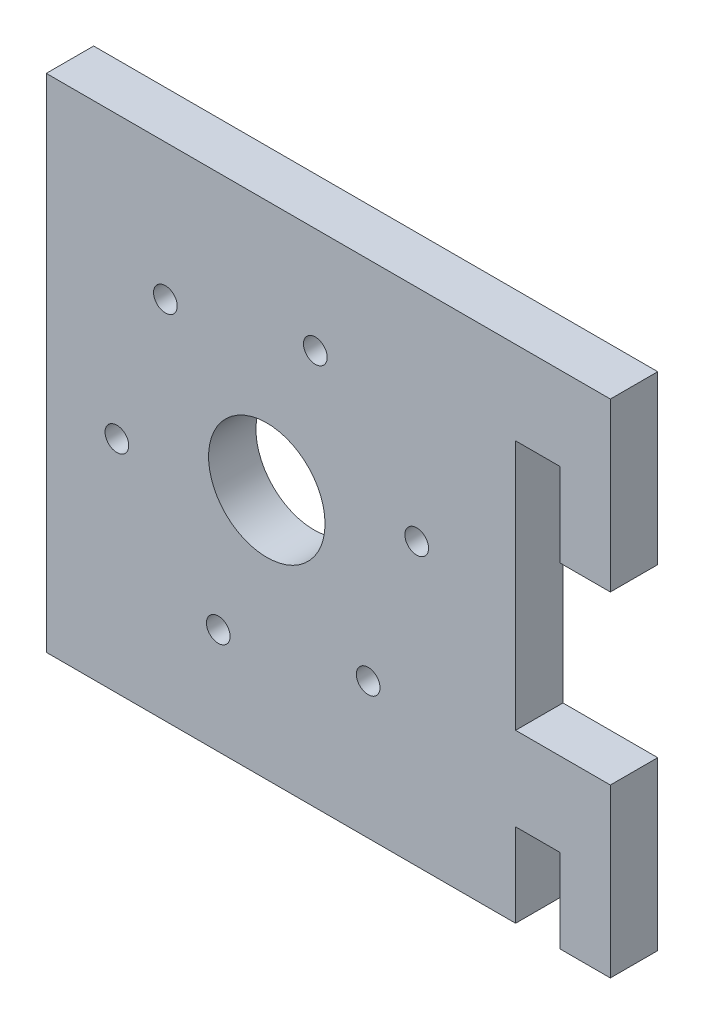
ISO-10303-21;
HEADER;
FILE_DESCRIPTION(('STEP AP214'),'2;1');
FILE_NAME('part.step','',(''),(''),'','','');
FILE_SCHEMA(('AUTOMOTIVE_DESIGN { 1 0 10303 214 1 1 1 1 }'));
ENDSEC;
DATA;
#1=APPLICATION_CONTEXT('core data for automotive mechanical design processes');
#2=APPLICATION_PROTOCOL_DEFINITION('international standard','automotive_design',2000,#1);
#3=PRODUCT_CONTEXT('',#1,'mechanical');
#4=PRODUCT('Part','Part','',(#3));
#5=PRODUCT_RELATED_PRODUCT_CATEGORY('part','',(#4));
#6=PRODUCT_DEFINITION_FORMATION('','',#4);
#7=PRODUCT_DEFINITION_CONTEXT('part definition',#1,'design');
#8=PRODUCT_DEFINITION('design','',#6,#7);
#9=PRODUCT_DEFINITION_SHAPE('','',#8);
#10=(LENGTH_UNIT() NAMED_UNIT(*) SI_UNIT(.MILLI.,.METRE.));
#11=(NAMED_UNIT(*) PLANE_ANGLE_UNIT() SI_UNIT($,.RADIAN.));
#12=(NAMED_UNIT(*) SI_UNIT($,.STERADIAN.) SOLID_ANGLE_UNIT());
#13=UNCERTAINTY_MEASURE_WITH_UNIT(LENGTH_MEASURE(1.E-05),#10,'distance_accuracy_value','');
#14=(GEOMETRIC_REPRESENTATION_CONTEXT(3) GLOBAL_UNCERTAINTY_ASSIGNED_CONTEXT((#13)) GLOBAL_UNIT_ASSIGNED_CONTEXT((#10,
#11,#12)) REPRESENTATION_CONTEXT('',''));
#15=CARTESIAN_POINT('',(0.,0.,0.));
#16=DIRECTION('',(0.,0.,1.));
#17=DIRECTION('',(1.,0.,0.));
#18=AXIS2_PLACEMENT_3D('',#15,#16,#17);
#19=CARTESIAN_POINT('',(0.,0.,4.800000052));
#20=DIRECTION('',(0.,0.,-1.));
#21=DIRECTION('',(-1.,0.,0.));
#22=AXIS2_PLACEMENT_3D('',#19,#20,#21);
#23=PLANE('',#22);
#24=CARTESIAN_POINT('',(22.3424569625795,25.3999999999998,4.800000052));
#25=DIRECTION('',(0.,0.,1.));
#26=DIRECTION('',(1.,0.,0.));
#27=AXIS2_PLACEMENT_3D('',#24,#25,#26);
#28=CIRCLE('',#27,5.9);
#29=CARTESIAN_POINT('',(28.2424569625795,25.3999999999998,4.800000052));
#30=VERTEX_POINT('',#29);
#31=EDGE_CURVE('E267',#30,#30,#28,.T.);
#32=ORIENTED_EDGE('',*,*,#31,.F.);
#33=EDGE_LOOP('',(#32));
#34=FACE_BOUND('',#33,.T.);
#35=CARTESIAN_POINT('',(12.0704461789188,37.0075748742084,4.800000052));
#36=DIRECTION('',(0.,0.,1.));
#37=DIRECTION('',(1.,0.,0.));
#38=AXIS2_PLACEMENT_3D('',#35,#36,#37);
#39=CIRCLE('',#38,1.19999999997775);
#40=CARTESIAN_POINT('',(13.2704461788966,37.0075748742084,4.800000052));
#41=VERTEX_POINT('',#40);
#42=EDGE_CURVE('E237',#41,#41,#39,.T.);
#43=ORIENTED_EDGE('',*,*,#42,.F.);
#44=EDGE_LOOP('',(#43));
#45=FACE_BOUND('',#44,.T.);
#46=CARTESIAN_POINT('',(7.15399685335458,22.3079651505062,4.800000052));
#47=DIRECTION('',(0.,0.,1.));
#48=DIRECTION('',(1.,0.,0.));
#49=AXIS2_PLACEMENT_3D('',#46,#47,#48);
#50=CIRCLE('',#49,1.19999999997706);
#51=CARTESIAN_POINT('',(8.35399685333163,22.3079651505062,4.800000052));
#52=VERTEX_POINT('',#51);
#53=EDGE_CURVE('E234',#52,#52,#50,.T.);
#54=ORIENTED_EDGE('',*,*,#53,.F.);
#55=EDGE_LOOP('',(#54));
#56=FACE_BOUND('',#55,.T.);
#57=CARTESIAN_POINT('',(17.4260076370153,10.7003902762977,4.800000052));
#58=DIRECTION('',(0.,0.,1.));
#59=DIRECTION('',(1.,0.,0.));
#60=AXIS2_PLACEMENT_3D('',#57,#58,#59);
#61=CIRCLE('',#60,1.19999999997815);
#62=CARTESIAN_POINT('',(18.6260076369934,10.7003902762977,4.800000052));
#63=VERTEX_POINT('',#62);
#64=EDGE_CURVE('E241',#63,#63,#61,.T.);
#65=ORIENTED_EDGE('',*,*,#64,.F.);
#66=EDGE_LOOP('',(#65));
#67=FACE_BOUND('',#66,.T.);
#68=CARTESIAN_POINT('',(32.6144677462402,13.7924251257913,4.800000052));
#69=DIRECTION('',(0.,0.,1.));
#70=DIRECTION('',(1.,0.,0.));
#71=AXIS2_PLACEMENT_3D('',#68,#69,#70);
#72=CIRCLE('',#71,1.19999999997572);
#73=CARTESIAN_POINT('',(33.814467746216,13.7924251257913,4.800000052));
#74=VERTEX_POINT('',#73);
#75=EDGE_CURVE('E247',#74,#74,#72,.T.);
#76=ORIENTED_EDGE('',*,*,#75,.F.);
#77=EDGE_LOOP('',(#76));
#78=FACE_BOUND('',#77,.T.);
#79=CARTESIAN_POINT('',(37.5309170718045,28.4920348494934,4.800000052));
#80=DIRECTION('',(0.,0.,1.));
#81=DIRECTION('',(1.,0.,0.));
#82=AXIS2_PLACEMENT_3D('',#79,#80,#81);
#83=CIRCLE('',#82,1.1999999999763);
#84=CARTESIAN_POINT('',(38.7309170717808,28.4920348494934,4.800000052));
#85=VERTEX_POINT('',#84);
#86=EDGE_CURVE('E253',#85,#85,#83,.T.);
#87=ORIENTED_EDGE('',*,*,#86,.F.);
#88=EDGE_LOOP('',(#87));
#89=FACE_BOUND('',#88,.T.);
#90=CARTESIAN_POINT('',(27.2589062881437,40.099609723702,4.800000052));
#91=DIRECTION('',(0.,0.,1.));
#92=DIRECTION('',(1.,0.,0.));
#93=AXIS2_PLACEMENT_3D('',#90,#91,#92);
#94=CIRCLE('',#93,1.1999999999763);
#95=CARTESIAN_POINT('',(28.45890628812,40.099609723702,4.800000052));
#96=VERTEX_POINT('',#95);
#97=EDGE_CURVE('E259',#96,#96,#94,.T.);
#98=ORIENTED_EDGE('',*,*,#97,.F.);
#99=EDGE_LOOP('',(#98));
#100=FACE_BOUND('',#99,.T.);
#101=DIRECTION('',(0.,1.,0.));
#102=VECTOR('',#101,1.);
#103=CARTESIAN_POINT('',(47.549999896,0.,4.800000052));
#104=LINE('',#103,#102);
#105=CARTESIAN_POINT('',(47.549999896,16.9333333333333,4.800000052));
#106=VERTEX_POINT('',#105);
#107=CARTESIAN_POINT('',(47.549999896,42.3333333333333,4.800000052));
#108=VERTEX_POINT('',#107);
#109=EDGE_CURVE('E189',#106,#108,#104,.T.);
#110=ORIENTED_EDGE('',*,*,#109,.T.);
#111=DIRECTION('',(1.,0.,0.));
#112=VECTOR('',#111,1.);
#113=CARTESIAN_POINT('',(47.549999896,42.3333333333333,4.800000052));
#114=LINE('',#113,#112);
#115=CARTESIAN_POINT('',(52.05000004,42.3333333333333,4.800000052));
#116=VERTEX_POINT('',#115);
#117=EDGE_CURVE('E195',#108,#116,#114,.T.);
#118=ORIENTED_EDGE('',*,*,#117,.T.);
#119=DIRECTION('',(0.,1.,0.));
#120=VECTOR('',#119,1.);
#121=CARTESIAN_POINT('',(52.05000004,33.8666666666667,4.800000052));
#122=LINE('',#121,#120);
#123=CARTESIAN_POINT('',(52.05000004,33.8666666666667,4.800000052));
#124=VERTEX_POINT('',#123);
#125=EDGE_CURVE('E201',#124,#116,#122,.T.);
#126=ORIENTED_EDGE('',*,*,#125,.F.);
#127=DIRECTION('',(-1.,0.,0.));
#128=VECTOR('',#127,1.);
#129=CARTESIAN_POINT('',(57.15,33.8666666666667,4.800000052));
#130=LINE('',#129,#128);
#131=CARTESIAN_POINT('',(57.15,33.8666666666667,4.800000052));
#132=VERTEX_POINT('',#131);
#133=EDGE_CURVE('E273',#132,#124,#130,.T.);
#134=ORIENTED_EDGE('',*,*,#133,.F.);
#135=DIRECTION('',(0.,1.,0.));
#136=VECTOR('',#135,1.);
#137=CARTESIAN_POINT('',(57.15,0.,4.800000052));
#138=LINE('',#137,#136);
#139=CARTESIAN_POINT('',(57.15,50.8,4.800000052));
#140=VERTEX_POINT('',#139);
#141=EDGE_CURVE('E301',#132,#140,#138,.T.);
#142=ORIENTED_EDGE('',*,*,#141,.T.);
#143=DIRECTION('',(-1.,0.,0.));
#144=VECTOR('',#143,1.);
#145=CARTESIAN_POINT('',(0.,50.8,4.800000052));
#146=LINE('',#145,#144);
#147=CARTESIAN_POINT('',(0.,50.8,4.800000052));
#148=VERTEX_POINT('',#147);
#149=EDGE_CURVE('E305',#140,#148,#146,.T.);
#150=ORIENTED_EDGE('',*,*,#149,.T.);
#151=DIRECTION('',(0.,-1.,0.));
#152=VECTOR('',#151,1.);
#153=CARTESIAN_POINT('',(0.,0.,4.800000052));
#154=LINE('',#153,#152);
#155=CARTESIAN_POINT('',(0.,0.,4.800000052));
#156=VERTEX_POINT('',#155);
#157=EDGE_CURVE('E293',#148,#156,#154,.T.);
#158=ORIENTED_EDGE('',*,*,#157,.T.);
#159=DIRECTION('',(1.,0.,0.));
#160=VECTOR('',#159,1.);
#161=CARTESIAN_POINT('',(0.,0.,4.800000052));
#162=LINE('',#161,#160);
#163=CARTESIAN_POINT('',(47.549999896,0.,4.800000052));
#164=VERTEX_POINT('',#163);
#165=EDGE_CURVE('E298',#156,#164,#162,.T.);
#166=ORIENTED_EDGE('',*,*,#165,.T.);
#167=DIRECTION('',(0.,1.,0.));
#168=VECTOR('',#167,1.);
#169=CARTESIAN_POINT('',(47.549999896,0.,4.800000052));
#170=LINE('',#169,#168);
#171=CARTESIAN_POINT('',(47.549999896,8.46666666666667,4.800000052));
#172=VERTEX_POINT('',#171);
#173=EDGE_CURVE('E213',#164,#172,#170,.T.);
#174=ORIENTED_EDGE('',*,*,#173,.T.);
#175=DIRECTION('',(1.,0.,0.));
#176=VECTOR('',#175,1.);
#177=CARTESIAN_POINT('',(47.549999896,8.46666666666667,4.800000052));
#178=LINE('',#177,#176);
#179=CARTESIAN_POINT('',(52.05000004,8.46666666666667,4.800000052));
#180=VERTEX_POINT('',#179);
#181=EDGE_CURVE('E219',#172,#180,#178,.T.);
#182=ORIENTED_EDGE('',*,*,#181,.T.);
#183=DIRECTION('',(0.,1.,0.));
#184=VECTOR('',#183,1.);
#185=CARTESIAN_POINT('',(52.05000004,0.,4.800000052));
#186=LINE('',#185,#184);
#187=CARTESIAN_POINT('',(52.05000004,0.,4.800000052));
#188=VERTEX_POINT('',#187);
#189=EDGE_CURVE('E222',#188,#180,#186,.T.);
#190=ORIENTED_EDGE('',*,*,#189,.F.);
#191=CARTESIAN_POINT('',(57.15,0.,4.800000052));
#192=VERTEX_POINT('',#191);
#193=EDGE_CURVE('E296',#188,#192,#162,.T.);
#194=ORIENTED_EDGE('',*,*,#193,.T.);
#195=CARTESIAN_POINT('',(57.15,16.9333333333333,4.800000052));
#196=VERTEX_POINT('',#195);
#197=EDGE_CURVE('E302',#192,#196,#138,.T.);
#198=ORIENTED_EDGE('',*,*,#197,.T.);
#199=DIRECTION('',(-1.,0.,0.));
#200=VECTOR('',#199,1.);
#201=CARTESIAN_POINT('',(57.15,16.9333333333333,4.800000052));
#202=LINE('',#201,#200);
#203=EDGE_CURVE('E283',#196,#106,#202,.T.);
#204=ORIENTED_EDGE('',*,*,#203,.T.);
#205=EDGE_LOOP('',(#110,#118,#126,#134,#142,#150,#158,#166,#174,#182,#190,#194,#198,#204));
#206=FACE_BOUND('',#205,.T.);
#207=ADVANCED_FACE('F76',(#34,#45,#56,#67,#78,#89,#100,#206),#23,.F.);
#208=CARTESIAN_POINT('',(0.,0.,0.));
#209=DIRECTION('',(0.,0.,-1.));
#210=DIRECTION('',(-1.,0.,0.));
#211=AXIS2_PLACEMENT_3D('',#208,#209,#210);
#212=PLANE('',#211);
#213=CARTESIAN_POINT('',(27.2589062881437,40.099609723702,0.));
#214=DIRECTION('',(0.,0.,1.));
#215=DIRECTION('',(1.,0.,0.));
#216=AXIS2_PLACEMENT_3D('',#213,#214,#215);
#217=CIRCLE('',#216,1.1999999999763);
#218=CARTESIAN_POINT('',(28.45890628812,40.099609723702,0.));
#219=VERTEX_POINT('',#218);
#220=EDGE_CURVE('E233',#219,#219,#217,.T.);
#221=ORIENTED_EDGE('',*,*,#220,.T.);
#222=EDGE_LOOP('',(#221));
#223=FACE_BOUND('',#222,.T.);
#224=CARTESIAN_POINT('',(37.5309170718045,28.4920348494934,0.));
#225=DIRECTION('',(0.,0.,1.));
#226=DIRECTION('',(1.,0.,0.));
#227=AXIS2_PLACEMENT_3D('',#224,#225,#226);
#228=CIRCLE('',#227,1.1999999999763);
#229=CARTESIAN_POINT('',(38.7309170717808,28.4920348494934,0.));
#230=VERTEX_POINT('',#229);
#231=EDGE_CURVE('E256',#230,#230,#228,.T.);
#232=ORIENTED_EDGE('',*,*,#231,.T.);
#233=EDGE_LOOP('',(#232));
#234=FACE_BOUND('',#233,.T.);
#235=CARTESIAN_POINT('',(32.6144677462402,13.7924251257913,0.));
#236=DIRECTION('',(0.,0.,1.));
#237=DIRECTION('',(1.,0.,0.));
#238=AXIS2_PLACEMENT_3D('',#235,#236,#237);
#239=CIRCLE('',#238,1.19999999997572);
#240=CARTESIAN_POINT('',(33.814467746216,13.7924251257913,0.));
#241=VERTEX_POINT('',#240);
#242=EDGE_CURVE('E250',#241,#241,#239,.T.);
#243=ORIENTED_EDGE('',*,*,#242,.T.);
#244=EDGE_LOOP('',(#243));
#245=FACE_BOUND('',#244,.T.);
#246=CARTESIAN_POINT('',(17.4260076370153,10.7003902762977,0.));
#247=DIRECTION('',(0.,0.,1.));
#248=DIRECTION('',(1.,0.,0.));
#249=AXIS2_PLACEMENT_3D('',#246,#247,#248);
#250=CIRCLE('',#249,1.19999999997815);
#251=CARTESIAN_POINT('',(18.6260076369934,10.7003902762977,0.));
#252=VERTEX_POINT('',#251);
#253=EDGE_CURVE('E244',#252,#252,#250,.T.);
#254=ORIENTED_EDGE('',*,*,#253,.T.);
#255=EDGE_LOOP('',(#254));
#256=FACE_BOUND('',#255,.T.);
#257=CARTESIAN_POINT('',(7.15399685335458,22.3079651505062,0.));
#258=DIRECTION('',(0.,0.,1.));
#259=DIRECTION('',(1.,0.,0.));
#260=AXIS2_PLACEMENT_3D('',#257,#258,#259);
#261=CIRCLE('',#260,1.19999999997706);
#262=CARTESIAN_POINT('',(8.35399685333163,22.3079651505062,0.));
#263=VERTEX_POINT('',#262);
#264=EDGE_CURVE('E238',#263,#263,#261,.T.);
#265=ORIENTED_EDGE('',*,*,#264,.T.);
#266=EDGE_LOOP('',(#265));
#267=FACE_BOUND('',#266,.T.);
#268=CARTESIAN_POINT('',(12.0704461789188,37.0075748742084,0.));
#269=DIRECTION('',(0.,0.,1.));
#270=DIRECTION('',(1.,0.,0.));
#271=AXIS2_PLACEMENT_3D('',#268,#269,#270);
#272=CIRCLE('',#271,1.19999999997775);
#273=CARTESIAN_POINT('',(13.2704461788966,37.0075748742084,0.));
#274=VERTEX_POINT('',#273);
#275=EDGE_CURVE('E264',#274,#274,#272,.T.);
#276=ORIENTED_EDGE('',*,*,#275,.T.);
#277=EDGE_LOOP('',(#276));
#278=FACE_BOUND('',#277,.T.);
#279=CARTESIAN_POINT('',(22.3424569625795,25.3999999999998,0.));
#280=DIRECTION('',(0.,0.,1.));
#281=DIRECTION('',(1.,0.,0.));
#282=AXIS2_PLACEMENT_3D('',#279,#280,#281);
#283=CIRCLE('',#282,5.9);
#284=CARTESIAN_POINT('',(28.2424569625795,25.3999999999998,0.));
#285=VERTEX_POINT('',#284);
#286=EDGE_CURVE('E270',#285,#285,#283,.T.);
#287=ORIENTED_EDGE('',*,*,#286,.T.);
#288=EDGE_LOOP('',(#287));
#289=FACE_BOUND('',#288,.T.);
#290=DIRECTION('',(1.,0.,0.));
#291=VECTOR('',#290,1.);
#292=CARTESIAN_POINT('',(47.549999896,42.3333333333333,0.));
#293=LINE('',#292,#291);
#294=CARTESIAN_POINT('',(47.549999896,42.3333333333333,0.));
#295=VERTEX_POINT('',#294);
#296=CARTESIAN_POINT('',(52.05000004,42.3333333333333,0.));
#297=VERTEX_POINT('',#296);
#298=EDGE_CURVE('E193',#295,#297,#293,.T.);
#299=ORIENTED_EDGE('',*,*,#298,.F.);
#300=DIRECTION('',(0.,1.,0.));
#301=VECTOR('',#300,1.);
#302=CARTESIAN_POINT('',(47.549999896,0.,0.));
#303=LINE('',#302,#301);
#304=CARTESIAN_POINT('',(47.549999896,16.9333333333333,0.));
#305=VERTEX_POINT('',#304);
#306=EDGE_CURVE('E178',#305,#295,#303,.T.);
#307=ORIENTED_EDGE('',*,*,#306,.F.);
#308=DIRECTION('',(-1.,0.,0.));
#309=VECTOR('',#308,1.);
#310=CARTESIAN_POINT('',(57.15,16.9333333333333,0.));
#311=LINE('',#310,#309);
#312=CARTESIAN_POINT('',(57.15,16.9333333333333,0.));
#313=VERTEX_POINT('',#312);
#314=EDGE_CURVE('E282',#313,#305,#311,.T.);
#315=ORIENTED_EDGE('',*,*,#314,.F.);
#316=DIRECTION('',(0.,1.,0.));
#317=VECTOR('',#316,1.);
#318=CARTESIAN_POINT('',(57.15,0.,0.));
#319=LINE('',#318,#317);
#320=CARTESIAN_POINT('',(57.15,0.,0.));
#321=VERTEX_POINT('',#320);
#322=EDGE_CURVE('E315',#321,#313,#319,.T.);
#323=ORIENTED_EDGE('',*,*,#322,.F.);
#324=DIRECTION('',(1.,0.,0.));
#325=VECTOR('',#324,1.);
#326=CARTESIAN_POINT('',(0.,0.,0.));
#327=LINE('',#326,#325);
#328=CARTESIAN_POINT('',(52.05000004,0.,0.));
#329=VERTEX_POINT('',#328);
#330=EDGE_CURVE('E310',#329,#321,#327,.T.);
#331=ORIENTED_EDGE('',*,*,#330,.F.);
#332=DIRECTION('',(0.,1.,0.));
#333=VECTOR('',#332,1.);
#334=CARTESIAN_POINT('',(52.05000004,0.,0.));
#335=LINE('',#334,#333);
#336=CARTESIAN_POINT('',(52.05000004,8.46666666666667,0.));
#337=VERTEX_POINT('',#336);
#338=EDGE_CURVE('E212',#329,#337,#335,.T.);
#339=ORIENTED_EDGE('',*,*,#338,.T.);
#340=DIRECTION('',(1.,0.,0.));
#341=VECTOR('',#340,1.);
#342=CARTESIAN_POINT('',(47.549999896,8.46666666666667,0.));
#343=LINE('',#342,#341);
#344=CARTESIAN_POINT('',(47.549999896,8.46666666666667,0.));
#345=VERTEX_POINT('',#344);
#346=EDGE_CURVE('E210',#345,#337,#343,.T.);
#347=ORIENTED_EDGE('',*,*,#346,.F.);
#348=DIRECTION('',(0.,1.,0.));
#349=VECTOR('',#348,1.);
#350=CARTESIAN_POINT('',(47.549999896,0.,0.));
#351=LINE('',#350,#349);
#352=CARTESIAN_POINT('',(47.549999896,0.,0.));
#353=VERTEX_POINT('',#352);
#354=EDGE_CURVE('E216',#353,#345,#351,.T.);
#355=ORIENTED_EDGE('',*,*,#354,.F.);
#356=CARTESIAN_POINT('',(0.,0.,0.));
#357=VERTEX_POINT('',#356);
#358=EDGE_CURVE('E311',#357,#353,#327,.T.);
#359=ORIENTED_EDGE('',*,*,#358,.F.);
#360=DIRECTION('',(0.,-1.,0.));
#361=VECTOR('',#360,1.);
#362=CARTESIAN_POINT('',(0.,0.,0.));
#363=LINE('',#362,#361);
#364=CARTESIAN_POINT('',(0.,50.8,0.));
#365=VERTEX_POINT('',#364);
#366=EDGE_CURVE('E279',#365,#357,#363,.T.);
#367=ORIENTED_EDGE('',*,*,#366,.F.);
#368=DIRECTION('',(-1.,0.,0.));
#369=VECTOR('',#368,1.);
#370=CARTESIAN_POINT('',(0.,50.8,0.));
#371=LINE('',#370,#369);
#372=CARTESIAN_POINT('',(57.15,50.8,0.));
#373=VERTEX_POINT('',#372);
#374=EDGE_CURVE('E297',#373,#365,#371,.T.);
#375=ORIENTED_EDGE('',*,*,#374,.F.);
#376=CARTESIAN_POINT('',(57.15,33.8666666666667,0.));
#377=VERTEX_POINT('',#376);
#378=EDGE_CURVE('E314',#377,#373,#319,.T.);
#379=ORIENTED_EDGE('',*,*,#378,.F.);
#380=DIRECTION('',(-1.,0.,0.));
#381=VECTOR('',#380,1.);
#382=CARTESIAN_POINT('',(57.15,33.8666666666667,0.));
#383=LINE('',#382,#381);
#384=CARTESIAN_POINT('',(52.05000004,33.8666666666667,0.));
#385=VERTEX_POINT('',#384);
#386=EDGE_CURVE('E280',#377,#385,#383,.T.);
#387=ORIENTED_EDGE('',*,*,#386,.T.);
#388=DIRECTION('',(0.,1.,0.));
#389=VECTOR('',#388,1.);
#390=CARTESIAN_POINT('',(52.05000004,33.8666666666667,0.));
#391=LINE('',#390,#389);
#392=EDGE_CURVE('E91',#385,#297,#391,.T.);
#393=ORIENTED_EDGE('',*,*,#392,.T.);
#394=EDGE_LOOP('',(#299,#307,#315,#323,#331,#339,#347,#355,#359,#367,#375,#379,#387,#393));
#395=FACE_BOUND('',#394,.T.);
#396=ADVANCED_FACE('F199',(#223,#234,#245,#256,#267,#278,#289,#395),#212,.T.);
#397=CARTESIAN_POINT('',(0.,0.,4.800000052));
#398=DIRECTION('',(0.,1.,0.));
#399=DIRECTION('',(0.,0.,1.));
#400=AXIS2_PLACEMENT_3D('',#397,#398,#399);
#401=PLANE('',#400);
#402=DIRECTION('',(0.,0.,1.));
#403=VECTOR('',#402,1.);
#404=CARTESIAN_POINT('',(47.549999896,0.,0.));
#405=LINE('',#404,#403);
#406=EDGE_CURVE('E99',#353,#164,#405,.T.);
#407=ORIENTED_EDGE('',*,*,#406,.T.);
#408=ORIENTED_EDGE('',*,*,#165,.F.);
#409=DIRECTION('',(0.,0.,-1.));
#410=VECTOR('',#409,1.);
#411=CARTESIAN_POINT('',(0.,0.,4.800000052));
#412=LINE('',#411,#410);
#413=EDGE_CURVE('E12',#156,#357,#412,.T.);
#414=ORIENTED_EDGE('',*,*,#413,.T.);
#415=ORIENTED_EDGE('',*,*,#358,.T.);
#416=EDGE_LOOP('',(#407,#408,#414,#415));
#417=FACE_BOUND('',#416,.T.);
#418=ADVANCED_FACE('F348',(#417),#401,.F.);
#419=CARTESIAN_POINT('',(57.15,0.,4.800000052));
#420=DIRECTION('',(-1.,0.,0.));
#421=DIRECTION('',(0.,0.,1.));
#422=AXIS2_PLACEMENT_3D('',#419,#420,#421);
#423=PLANE('',#422);
#424=DIRECTION('',(0.,0.,1.));
#425=VECTOR('',#424,1.);
#426=CARTESIAN_POINT('',(57.15,16.9333333333333,0.));
#427=LINE('',#426,#425);
#428=EDGE_CURVE('E285',#313,#196,#427,.T.);
#429=ORIENTED_EDGE('',*,*,#428,.T.);
#430=ORIENTED_EDGE('',*,*,#197,.F.);
#431=DIRECTION('',(0.,0.,-1.));
#432=VECTOR('',#431,1.);
#433=CARTESIAN_POINT('',(57.15,0.,4.800000052));
#434=LINE('',#433,#432);
#435=EDGE_CURVE('E84',#192,#321,#434,.T.);
#436=ORIENTED_EDGE('',*,*,#435,.T.);
#437=ORIENTED_EDGE('',*,*,#322,.T.);
#438=EDGE_LOOP('',(#429,#430,#436,#437));
#439=FACE_BOUND('',#438,.T.);
#440=ADVANCED_FACE('F328',(#439),#423,.F.);
#441=CARTESIAN_POINT('',(0.,0.,4.800000052));
#442=DIRECTION('',(1.,0.,0.));
#443=DIRECTION('',(0.,0.,-1.));
#444=AXIS2_PLACEMENT_3D('',#441,#442,#443);
#445=PLANE('',#444);
#446=ORIENTED_EDGE('',*,*,#366,.T.);
#447=ORIENTED_EDGE('',*,*,#413,.F.);
#448=ORIENTED_EDGE('',*,*,#157,.F.);
#449=DIRECTION('',(0.,0.,-1.));
#450=VECTOR('',#449,1.);
#451=CARTESIAN_POINT('',(0.,50.8,4.800000052));
#452=LINE('',#451,#450);
#453=EDGE_CURVE('E307',#148,#365,#452,.T.);
#454=ORIENTED_EDGE('',*,*,#453,.T.);
#455=EDGE_LOOP('',(#446,#447,#448,#454));
#456=FACE_BOUND('',#455,.T.);
#457=ADVANCED_FACE('F78',(#456),#445,.F.);
#458=ORIENTED_EDGE('',*,*,#193,.F.);
#459=DIRECTION('',(0.,0.,1.));
#460=VECTOR('',#459,1.);
#461=CARTESIAN_POINT('',(52.05000004,0.,0.));
#462=LINE('',#461,#460);
#463=EDGE_CURVE('E229',#329,#188,#462,.T.);
#464=ORIENTED_EDGE('',*,*,#463,.F.);
#465=ORIENTED_EDGE('',*,*,#330,.T.);
#466=ORIENTED_EDGE('',*,*,#435,.F.);
#467=EDGE_LOOP('',(#458,#464,#465,#466));
#468=FACE_BOUND('',#467,.T.);
#469=ADVANCED_FACE('F337',(#468),#401,.F.);
#470=ORIENTED_EDGE('',*,*,#141,.F.);
#471=DIRECTION('',(0.,0.,1.));
#472=VECTOR('',#471,1.);
#473=CARTESIAN_POINT('',(57.15,33.8666666666667,0.));
#474=LINE('',#473,#472);
#475=EDGE_CURVE('E277',#377,#132,#474,.T.);
#476=ORIENTED_EDGE('',*,*,#475,.F.);
#477=ORIENTED_EDGE('',*,*,#378,.T.);
#478=DIRECTION('',(0.,0.,-1.));
#479=VECTOR('',#478,1.);
#480=CARTESIAN_POINT('',(57.15,50.8,4.800000052));
#481=LINE('',#480,#479);
#482=EDGE_CURVE('E321',#140,#373,#481,.T.);
#483=ORIENTED_EDGE('',*,*,#482,.F.);
#484=EDGE_LOOP('',(#470,#476,#477,#483));
#485=FACE_BOUND('',#484,.T.);
#486=ADVANCED_FACE('F362',(#485),#423,.F.);
#487=CARTESIAN_POINT('',(0.,50.8,4.800000052));
#488=DIRECTION('',(0.,-1.,0.));
#489=DIRECTION('',(0.,0.,-1.));
#490=AXIS2_PLACEMENT_3D('',#487,#488,#489);
#491=PLANE('',#490);
#492=ORIENTED_EDGE('',*,*,#374,.T.);
#493=ORIENTED_EDGE('',*,*,#453,.F.);
#494=ORIENTED_EDGE('',*,*,#149,.F.);
#495=ORIENTED_EDGE('',*,*,#482,.T.);
#496=EDGE_LOOP('',(#492,#493,#494,#495));
#497=FACE_BOUND('',#496,.T.);
#498=ADVANCED_FACE('F358',(#497),#491,.F.);
#499=CARTESIAN_POINT('',(47.549999896,0.,0.));
#500=DIRECTION('',(1.,0.,0.));
#501=DIRECTION('',(0.,0.,-1.));
#502=AXIS2_PLACEMENT_3D('',#499,#500,#501);
#503=PLANE('',#502);
#504=ORIENTED_EDGE('',*,*,#109,.F.);
#505=DIRECTION('',(0.,0.,1.));
#506=VECTOR('',#505,1.);
#507=CARTESIAN_POINT('',(47.549999896,16.9333333333333,0.));
#508=LINE('',#507,#506);
#509=EDGE_CURVE('E184',#305,#106,#508,.T.);
#510=ORIENTED_EDGE('',*,*,#509,.F.);
#511=ORIENTED_EDGE('',*,*,#306,.T.);
#512=DIRECTION('',(0.,0.,1.));
#513=VECTOR('',#512,1.);
#514=CARTESIAN_POINT('',(47.549999896,42.3333333333333,0.));
#515=LINE('',#514,#513);
#516=EDGE_CURVE('E182',#295,#108,#515,.T.);
#517=ORIENTED_EDGE('',*,*,#516,.T.);
#518=EDGE_LOOP('',(#504,#510,#511,#517));
#519=FACE_BOUND('',#518,.T.);
#520=ADVANCED_FACE('F181',(#519),#503,.T.);
#521=CARTESIAN_POINT('',(57.15,33.8666666666667,0.));
#522=DIRECTION('',(0.,1.,0.));
#523=DIRECTION('',(0.,0.,1.));
#524=AXIS2_PLACEMENT_3D('',#521,#522,#523);
#525=PLANE('',#524);
#526=ORIENTED_EDGE('',*,*,#133,.T.);
#527=DIRECTION('',(0.,0.,1.));
#528=VECTOR('',#527,1.);
#529=CARTESIAN_POINT('',(52.05000004,33.8666666666667,0.));
#530=LINE('',#529,#528);
#531=EDGE_CURVE('E196',#385,#124,#530,.T.);
#532=ORIENTED_EDGE('',*,*,#531,.F.);
#533=ORIENTED_EDGE('',*,*,#386,.F.);
#534=ORIENTED_EDGE('',*,*,#475,.T.);
#535=EDGE_LOOP('',(#526,#532,#533,#534));
#536=FACE_BOUND('',#535,.T.);
#537=ADVANCED_FACE('F366',(#536),#525,.F.);
#538=CARTESIAN_POINT('',(57.15,16.9333333333333,0.));
#539=DIRECTION('',(0.,1.,0.));
#540=DIRECTION('',(0.,0.,1.));
#541=AXIS2_PLACEMENT_3D('',#538,#539,#540);
#542=PLANE('',#541);
#543=ORIENTED_EDGE('',*,*,#203,.F.);
#544=ORIENTED_EDGE('',*,*,#428,.F.);
#545=ORIENTED_EDGE('',*,*,#314,.T.);
#546=ORIENTED_EDGE('',*,*,#509,.T.);
#547=EDGE_LOOP('',(#543,#544,#545,#546));
#548=FACE_BOUND('',#547,.T.);
#549=ADVANCED_FACE('F333',(#548),#542,.T.);
#550=CARTESIAN_POINT('',(22.3424569625795,25.3999999999998,0.));
#551=DIRECTION('',(0.,0.,1.));
#552=DIRECTION('',(1.,0.,0.));
#553=AXIS2_PLACEMENT_3D('',#550,#551,#552);
#554=CYLINDRICAL_SURFACE('',#553,5.9);
#555=ORIENTED_EDGE('',*,*,#286,.F.);
#556=EDGE_LOOP('',(#555));
#557=FACE_BOUND('',#556,.T.);
#558=ORIENTED_EDGE('',*,*,#31,.T.);
#559=EDGE_LOOP('',(#558));
#560=FACE_BOUND('',#559,.T.);
#561=ADVANCED_FACE('F437',(#557,#560),#554,.F.);
#562=CARTESIAN_POINT('',(12.0704461789188,37.0075748742084,0.));
#563=DIRECTION('',(0.,0.,1.));
#564=DIRECTION('',(1.,0.,0.));
#565=AXIS2_PLACEMENT_3D('',#562,#563,#564);
#566=CYLINDRICAL_SURFACE('',#565,1.19999999997775);
#567=ORIENTED_EDGE('',*,*,#275,.F.);
#568=EDGE_LOOP('',(#567));
#569=FACE_BOUND('',#568,.T.);
#570=ORIENTED_EDGE('',*,*,#42,.T.);
#571=EDGE_LOOP('',(#570));
#572=FACE_BOUND('',#571,.T.);
#573=ADVANCED_FACE('F443',(#569,#572),#566,.F.);
#574=CARTESIAN_POINT('',(7.15399685335458,22.3079651505062,0.));
#575=DIRECTION('',(0.,0.,1.));
#576=DIRECTION('',(1.,0.,0.));
#577=AXIS2_PLACEMENT_3D('',#574,#575,#576);
#578=CYLINDRICAL_SURFACE('',#577,1.19999999997706);
#579=ORIENTED_EDGE('',*,*,#264,.F.);
#580=EDGE_LOOP('',(#579));
#581=FACE_BOUND('',#580,.T.);
#582=ORIENTED_EDGE('',*,*,#53,.T.);
#583=EDGE_LOOP('',(#582));
#584=FACE_BOUND('',#583,.T.);
#585=ADVANCED_FACE('F451',(#581,#584),#578,.F.);
#586=CARTESIAN_POINT('',(17.4260076370153,10.7003902762977,0.));
#587=DIRECTION('',(0.,0.,1.));
#588=DIRECTION('',(1.,0.,0.));
#589=AXIS2_PLACEMENT_3D('',#586,#587,#588);
#590=CYLINDRICAL_SURFACE('',#589,1.19999999997815);
#591=ORIENTED_EDGE('',*,*,#253,.F.);
#592=EDGE_LOOP('',(#591));
#593=FACE_BOUND('',#592,.T.);
#594=ORIENTED_EDGE('',*,*,#64,.T.);
#595=EDGE_LOOP('',(#594));
#596=FACE_BOUND('',#595,.T.);
#597=ADVANCED_FACE('F459',(#593,#596),#590,.F.);
#598=CARTESIAN_POINT('',(32.6144677462402,13.7924251257913,0.));
#599=DIRECTION('',(0.,0.,1.));
#600=DIRECTION('',(1.,0.,0.));
#601=AXIS2_PLACEMENT_3D('',#598,#599,#600);
#602=CYLINDRICAL_SURFACE('',#601,1.19999999997572);
#603=ORIENTED_EDGE('',*,*,#242,.F.);
#604=EDGE_LOOP('',(#603));
#605=FACE_BOUND('',#604,.T.);
#606=ORIENTED_EDGE('',*,*,#75,.T.);
#607=EDGE_LOOP('',(#606));
#608=FACE_BOUND('',#607,.T.);
#609=ADVANCED_FACE('F467',(#605,#608),#602,.F.);
#610=CARTESIAN_POINT('',(37.5309170718045,28.4920348494934,0.));
#611=DIRECTION('',(0.,0.,1.));
#612=DIRECTION('',(1.,0.,0.));
#613=AXIS2_PLACEMENT_3D('',#610,#611,#612);
#614=CYLINDRICAL_SURFACE('',#613,1.1999999999763);
#615=ORIENTED_EDGE('',*,*,#231,.F.);
#616=EDGE_LOOP('',(#615));
#617=FACE_BOUND('',#616,.T.);
#618=ORIENTED_EDGE('',*,*,#86,.T.);
#619=EDGE_LOOP('',(#618));
#620=FACE_BOUND('',#619,.T.);
#621=ADVANCED_FACE('F475',(#617,#620),#614,.F.);
#622=CARTESIAN_POINT('',(27.2589062881437,40.099609723702,0.));
#623=DIRECTION('',(0.,0.,1.));
#624=DIRECTION('',(1.,0.,0.));
#625=AXIS2_PLACEMENT_3D('',#622,#623,#624);
#626=CYLINDRICAL_SURFACE('',#625,1.1999999999763);
#627=ORIENTED_EDGE('',*,*,#220,.F.);
#628=EDGE_LOOP('',(#627));
#629=FACE_BOUND('',#628,.T.);
#630=ORIENTED_EDGE('',*,*,#97,.T.);
#631=EDGE_LOOP('',(#630));
#632=FACE_BOUND('',#631,.T.);
#633=ADVANCED_FACE('F483',(#629,#632),#626,.F.);
#634=CARTESIAN_POINT('',(47.549999896,8.46666666666667,0.));
#635=DIRECTION('',(0.,-1.,0.));
#636=DIRECTION('',(0.,0.,-1.));
#637=AXIS2_PLACEMENT_3D('',#634,#635,#636);
#638=PLANE('',#637);
#639=ORIENTED_EDGE('',*,*,#181,.F.);
#640=DIRECTION('',(0.,0.,1.));
#641=VECTOR('',#640,1.);
#642=CARTESIAN_POINT('',(47.549999896,8.46666666666667,0.));
#643=LINE('',#642,#641);
#644=EDGE_CURVE('E218',#345,#172,#643,.T.);
#645=ORIENTED_EDGE('',*,*,#644,.F.);
#646=ORIENTED_EDGE('',*,*,#346,.T.);
#647=DIRECTION('',(0.,0.,1.));
#648=VECTOR('',#647,1.);
#649=CARTESIAN_POINT('',(52.05000004,8.46666666666667,0.));
#650=LINE('',#649,#648);
#651=EDGE_CURVE('E231',#337,#180,#650,.T.);
#652=ORIENTED_EDGE('',*,*,#651,.T.);
#653=EDGE_LOOP('',(#639,#645,#646,#652));
#654=FACE_BOUND('',#653,.T.);
#655=ADVANCED_FACE('F345',(#654),#638,.T.);
#656=CARTESIAN_POINT('',(52.05000004,0.,0.));
#657=DIRECTION('',(1.,0.,0.));
#658=DIRECTION('',(0.,0.,-1.));
#659=AXIS2_PLACEMENT_3D('',#656,#657,#658);
#660=PLANE('',#659);
#661=ORIENTED_EDGE('',*,*,#189,.T.);
#662=ORIENTED_EDGE('',*,*,#651,.F.);
#663=ORIENTED_EDGE('',*,*,#338,.F.);
#664=ORIENTED_EDGE('',*,*,#463,.T.);
#665=EDGE_LOOP('',(#661,#662,#663,#664));
#666=FACE_BOUND('',#665,.T.);
#667=ADVANCED_FACE('F339',(#666),#660,.F.);
#668=CARTESIAN_POINT('',(47.549999896,0.,0.));
#669=DIRECTION('',(1.,0.,0.));
#670=DIRECTION('',(0.,0.,-1.));
#671=AXIS2_PLACEMENT_3D('',#668,#669,#670);
#672=PLANE('',#671);
#673=ORIENTED_EDGE('',*,*,#173,.F.);
#674=ORIENTED_EDGE('',*,*,#406,.F.);
#675=ORIENTED_EDGE('',*,*,#354,.T.);
#676=ORIENTED_EDGE('',*,*,#644,.T.);
#677=EDGE_LOOP('',(#673,#674,#675,#676));
#678=FACE_BOUND('',#677,.T.);
#679=ADVANCED_FACE('F346',(#678),#672,.T.);
#680=CARTESIAN_POINT('',(52.05000004,33.8666666666667,0.));
#681=DIRECTION('',(1.,0.,0.));
#682=DIRECTION('',(0.,0.,-1.));
#683=AXIS2_PLACEMENT_3D('',#680,#681,#682);
#684=PLANE('',#683);
#685=ORIENTED_EDGE('',*,*,#125,.T.);
#686=DIRECTION('',(0.,0.,1.));
#687=VECTOR('',#686,1.);
#688=CARTESIAN_POINT('',(52.05000004,42.3333333333333,0.));
#689=LINE('',#688,#687);
#690=EDGE_CURVE('E197',#297,#116,#689,.T.);
#691=ORIENTED_EDGE('',*,*,#690,.F.);
#692=ORIENTED_EDGE('',*,*,#392,.F.);
#693=ORIENTED_EDGE('',*,*,#531,.T.);
#694=EDGE_LOOP('',(#685,#691,#692,#693));
#695=FACE_BOUND('',#694,.T.);
#696=ADVANCED_FACE('F368',(#695),#684,.F.);
#697=CARTESIAN_POINT('',(47.549999896,42.3333333333333,0.));
#698=DIRECTION('',(0.,-1.,0.));
#699=DIRECTION('',(0.,0.,-1.));
#700=AXIS2_PLACEMENT_3D('',#697,#698,#699);
#701=PLANE('',#700);
#702=ORIENTED_EDGE('',*,*,#117,.F.);
#703=ORIENTED_EDGE('',*,*,#516,.F.);
#704=ORIENTED_EDGE('',*,*,#298,.T.);
#705=ORIENTED_EDGE('',*,*,#690,.T.);
#706=EDGE_LOOP('',(#702,#703,#704,#705));
#707=FACE_BOUND('',#706,.T.);
#708=ADVANCED_FACE('F192',(#707),#701,.T.);
#709=CLOSED_SHELL('',(#207,#396,#418,#440,#457,#469,#486,#498,#520,#537,#549,#561,#573,#585,
#597,#609,#621,#633,#655,#667,#679,#696,#708));
#710=MANIFOLD_SOLID_BREP('B2',#709);
#711=ADVANCED_BREP_SHAPE_REPRESENTATION('',(#18,#710),#14);
#712=SHAPE_DEFINITION_REPRESENTATION(#9,#711);
ENDSEC;
END-ISO-10303-21;
